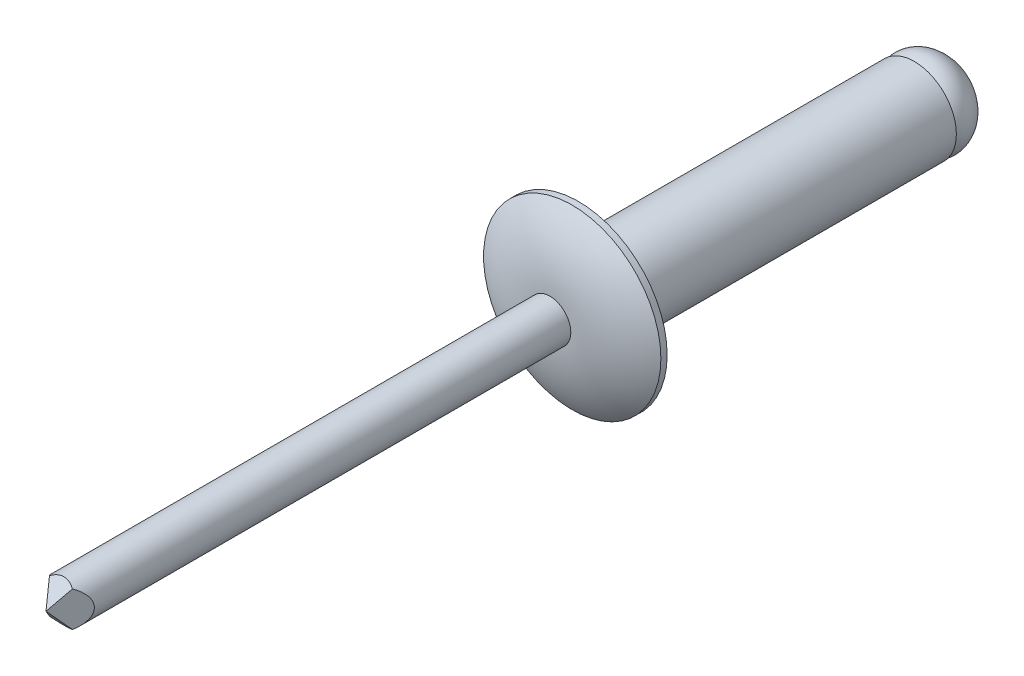
ISO-10303-21;
HEADER;
FILE_DESCRIPTION(('STEP AP214'),'2;1');
FILE_NAME('part.step','',(''),(''),'','','');
FILE_SCHEMA(('AUTOMOTIVE_DESIGN { 1 0 10303 214 1 1 1 1 }'));
ENDSEC;
DATA;
#1=APPLICATION_CONTEXT('core data for automotive mechanical design processes');
#2=APPLICATION_PROTOCOL_DEFINITION('international standard','automotive_design',2000,#1);
#3=PRODUCT_CONTEXT('',#1,'mechanical');
#4=PRODUCT('Part','Part','',(#3));
#5=PRODUCT_RELATED_PRODUCT_CATEGORY('part','',(#4));
#6=PRODUCT_DEFINITION_FORMATION('','',#4);
#7=PRODUCT_DEFINITION_CONTEXT('part definition',#1,'design');
#8=PRODUCT_DEFINITION('design','',#6,#7);
#9=PRODUCT_DEFINITION_SHAPE('','',#8);
#10=(LENGTH_UNIT() NAMED_UNIT(*) SI_UNIT(.MILLI.,.METRE.));
#11=(NAMED_UNIT(*) PLANE_ANGLE_UNIT() SI_UNIT($,.RADIAN.));
#12=(NAMED_UNIT(*) SI_UNIT($,.STERADIAN.) SOLID_ANGLE_UNIT());
#13=UNCERTAINTY_MEASURE_WITH_UNIT(LENGTH_MEASURE(1.E-05),#10,'distance_accuracy_value','');
#14=(GEOMETRIC_REPRESENTATION_CONTEXT(3) GLOBAL_UNCERTAINTY_ASSIGNED_CONTEXT((#13)) GLOBAL_UNIT_ASSIGNED_CONTEXT((#10,
#11,#12)) REPRESENTATION_CONTEXT('',''));
#15=CARTESIAN_POINT('',(0.,0.,0.));
#16=DIRECTION('',(0.,0.,1.));
#17=DIRECTION('',(1.,0.,0.));
#18=AXIS2_PLACEMENT_3D('',#15,#16,#17);
#19=CARTESIAN_POINT('',(0.,0.,-9.8298));
#20=DIRECTION('',(1.,0.,0.));
#21=DIRECTION('',(0.,-1.,0.));
#22=AXIS2_PLACEMENT_3D('',#19,#20,#21);
#23=ELLIPSE('',#22,1.190625,0.914400000000001);
#24=TRIMMED_CURVE('',#23,(PARAMETER_VALUE(1.5707963267949)),(PARAMETER_VALUE(4.71238898038469)),
.T.,.PARAMETER.);
#25=CARTESIAN_POINT('',(0.,0.,15.1003));
#26=DIRECTION('',(0.,0.,1.));
#27=AXIS1_PLACEMENT('',#25,#26);
#28=SURFACE_OF_REVOLUTION('',#24,#27);
#29=CARTESIAN_POINT('',(0.,0.,-9.525));
#30=DIRECTION('',(0.,0.,1.));
#31=DIRECTION('',(1.,0.,0.));
#32=AXIS2_PLACEMENT_3D('',#29,#30,#31);
#33=CIRCLE('',#32,1.12253201513364);
#34=CARTESIAN_POINT('',(1.12253201513364,0.,-9.525));
#35=VERTEX_POINT('',#34);
#36=EDGE_CURVE('E83',#35,#35,#33,.T.);
#37=ORIENTED_EDGE('',*,*,#36,.F.);
#38=EDGE_LOOP('',(#37));
#39=FACE_BOUND('',#38,.T.);
#40=CARTESIAN_POINT('',(0.,0.,-10.7442));
#41=VERTEX_POINT('',#40);
#42=VERTEX_LOOP('',#41);
#43=FACE_BOUND('',#42,.T.);
#44=ADVANCED_FACE('F34',(#39,#43),#28,.T.);
#45=CARTESIAN_POINT('',(0.,1.12253201513364,-9.525));
#46=DIRECTION('',(0.,0.,1.));
#47=DIRECTION('',(1.,0.,0.));
#48=AXIS2_PLACEMENT_3D('',#45,#46,#47);
#49=PLANE('',#48);
#50=CARTESIAN_POINT('',(0.,0.,-9.525));
#51=DIRECTION('',(0.,0.,1.));
#52=DIRECTION('',(1.,0.,0.));
#53=AXIS2_PLACEMENT_3D('',#50,#51,#52);
#54=CIRCLE('',#53,1.190625);
#55=CARTESIAN_POINT('',(1.190625,0.,-9.525));
#56=VERTEX_POINT('',#55);
#57=EDGE_CURVE('E87',#56,#56,#54,.T.);
#58=ORIENTED_EDGE('',*,*,#57,.F.);
#59=EDGE_LOOP('',(#58));
#60=FACE_BOUND('',#59,.T.);
#61=ORIENTED_EDGE('',*,*,#36,.T.);
#62=EDGE_LOOP('',(#61));
#63=FACE_BOUND('',#62,.T.);
#64=ADVANCED_FACE('F119',(#60,#63),#49,.F.);
#65=CARTESIAN_POINT('',(0.,0.,15.1003));
#66=DIRECTION('',(0.,0.,1.));
#67=DIRECTION('',(1.,0.,0.));
#68=AXIS2_PLACEMENT_3D('',#65,#66,#67);
#69=CYLINDRICAL_SURFACE('',#68,1.190625);
#70=CARTESIAN_POINT('',(0.,0.,0.));
#71=DIRECTION('',(0.,0.,1.));
#72=DIRECTION('',(1.,0.,0.));
#73=AXIS2_PLACEMENT_3D('',#70,#71,#72);
#74=CIRCLE('',#73,1.190625);
#75=CARTESIAN_POINT('',(1.190625,0.,0.));
#76=VERTEX_POINT('',#75);
#77=EDGE_CURVE('E92',#76,#76,#74,.T.);
#78=ORIENTED_EDGE('',*,*,#77,.F.);
#79=EDGE_LOOP('',(#78));
#80=FACE_BOUND('',#79,.T.);
#81=ORIENTED_EDGE('',*,*,#57,.T.);
#82=EDGE_LOOP('',(#81));
#83=FACE_BOUND('',#82,.T.);
#84=ADVANCED_FACE('F124',(#80,#83),#69,.T.);
#85=CARTESIAN_POINT('',(0.,1.190625,0.));
#86=DIRECTION('',(0.,0.,1.));
#87=DIRECTION('',(1.,0.,0.));
#88=AXIS2_PLACEMENT_3D('',#85,#86,#87);
#89=PLANE('',#88);
#90=CARTESIAN_POINT('',(0.,0.,0.));
#91=DIRECTION('',(0.,0.,1.));
#92=DIRECTION('',(1.,0.,0.));
#93=AXIS2_PLACEMENT_3D('',#90,#91,#92);
#94=CIRCLE('',#93,2.5146);
#95=CARTESIAN_POINT('',(2.5146,0.,0.));
#96=VERTEX_POINT('',#95);
#97=EDGE_CURVE('E95',#96,#96,#94,.T.);
#98=ORIENTED_EDGE('',*,*,#97,.F.);
#99=EDGE_LOOP('',(#98));
#100=FACE_BOUND('',#99,.T.);
#101=ORIENTED_EDGE('',*,*,#77,.T.);
#102=EDGE_LOOP('',(#101));
#103=FACE_BOUND('',#102,.T.);
#104=ADVANCED_FACE('F131',(#100,#103),#89,.F.);
#105=CARTESIAN_POINT('',(0.,0.,15.1003));
#106=DIRECTION('',(0.,0.,1.));
#107=DIRECTION('',(1.,0.,0.));
#108=AXIS2_PLACEMENT_3D('',#105,#106,#107);
#109=CYLINDRICAL_SURFACE('',#108,2.5146);
#110=CARTESIAN_POINT('',(0.,0.,0.177799999999999));
#111=DIRECTION('',(0.,0.,1.));
#112=DIRECTION('',(1.,0.,0.));
#113=AXIS2_PLACEMENT_3D('',#110,#111,#112);
#114=CIRCLE('',#113,2.5146);
#115=CARTESIAN_POINT('',(2.5146,0.,0.177799999999999));
#116=VERTEX_POINT('',#115);
#117=EDGE_CURVE('E98',#116,#116,#114,.T.);
#118=ORIENTED_EDGE('',*,*,#117,.F.);
#119=EDGE_LOOP('',(#118));
#120=FACE_BOUND('',#119,.T.);
#121=ORIENTED_EDGE('',*,*,#97,.T.);
#122=EDGE_LOOP('',(#121));
#123=FACE_BOUND('',#122,.T.);
#124=ADVANCED_FACE('F138',(#120,#123),#109,.T.);
#125=CARTESIAN_POINT('',(0.,0.,-2.40522323437499));
#126=DIRECTION('',(0.,0.,1.));
#127=DIRECTION('',(1.,0.,0.));
#128=AXIS2_PLACEMENT_3D('',#125,#126,#127);
#129=DEGENERATE_TOROIDAL_SURFACE('',#128,0.595312500000002,3.21802323437499,.T.);
#130=CARTESIAN_POINT('',(0.,0.,0.812800000000001));
#131=DIRECTION('',(0.,0.,1.));
#132=DIRECTION('',(1.,0.,0.));
#133=AXIS2_PLACEMENT_3D('',#130,#131,#132);
#134=CIRCLE('',#133,0.5953125);
#135=CARTESIAN_POINT('',(0.5953125,0.,0.812800000000001));
#136=VERTEX_POINT('',#135);
#137=EDGE_CURVE('E101',#136,#136,#134,.T.);
#138=ORIENTED_EDGE('',*,*,#137,.F.);
#139=EDGE_LOOP('',(#138));
#140=FACE_BOUND('',#139,.T.);
#141=ORIENTED_EDGE('',*,*,#117,.T.);
#142=EDGE_LOOP('',(#141));
#143=FACE_BOUND('',#142,.T.);
#144=ADVANCED_FACE('F142',(#140,#143),#129,.T.);
#145=CARTESIAN_POINT('',(0.,0.,15.1003));
#146=DIRECTION('',(0.,0.,1.));
#147=DIRECTION('',(1.,0.,0.));
#148=AXIS2_PLACEMENT_3D('',#145,#146,#147);
#149=CYLINDRICAL_SURFACE('',#148,0.595312499999999);
#150=CARTESIAN_POINT('',(0.,0.,15.1003));
#151=DIRECTION('',(-0.793353340291234,0.,-0.608761429008722));
#152=DIRECTION('',(-0.608761429008723,0.,0.793353340291234));
#153=AXIS2_PLACEMENT_3D('',#150,#151,#152);
#154=ELLIPSE('',#153,0.977907718249129,0.595312499999999);
#155=CARTESIAN_POINT('',(0.325200038106839,0.498640058430488,14.6764910590902));
#156=VERTEX_POINT('',#155);
#157=CARTESIAN_POINT('',(0.325200038106838,-0.498640058430487,14.6764910590902));
#158=VERTEX_POINT('',#157);
#159=EDGE_CURVE('E78',#156,#158,#154,.T.);
#160=ORIENTED_EDGE('',*,*,#159,.T.);
#161=CARTESIAN_POINT('',(0.,0.,15.1003));
#162=DIRECTION('',(0.,0.647617273393592,-0.761965791359592));
#163=DIRECTION('',(0.,0.761965791359592,0.647617273393593));
#164=AXIS2_PLACEMENT_3D('',#161,#162,#163);
#165=ELLIPSE('',#164,0.781285074409666,0.595312499999999);
#166=CARTESIAN_POINT('',(-0.325200038106838,-0.498640058430487,14.6764910590902));
#167=VERTEX_POINT('',#166);
#168=EDGE_CURVE('E103',#158,#167,#165,.T.);
#169=ORIENTED_EDGE('',*,*,#168,.T.);
#170=CARTESIAN_POINT('',(0.,0.,15.1003));
#171=DIRECTION('',(0.793353340291234,0.,-0.608761429008722));
#172=DIRECTION('',(0.608761429008722,0.,0.793353340291234));
#173=AXIS2_PLACEMENT_3D('',#170,#171,#172);
#174=ELLIPSE('',#173,0.97790771824913,0.595312499999999);
#175=CARTESIAN_POINT('',(-0.325200038106838,0.498640058430487,14.6764910590902));
#176=VERTEX_POINT('',#175);
#177=EDGE_CURVE('E71',#167,#176,#174,.T.);
#178=ORIENTED_EDGE('',*,*,#177,.T.);
#179=CARTESIAN_POINT('',(0.,0.,15.1003));
#180=DIRECTION('',(0.,-0.647617273393592,-0.761965791359592));
#181=DIRECTION('',(0.,-0.761965791359592,0.647617273393593));
#182=AXIS2_PLACEMENT_3D('',#179,#180,#181);
#183=ELLIPSE('',#182,0.781285074409666,0.595312499999999);
#184=EDGE_CURVE('E65',#176,#156,#183,.T.);
#185=ORIENTED_EDGE('',*,*,#184,.T.);
#186=EDGE_LOOP('',(#160,#169,#178,#185));
#187=FACE_BOUND('',#186,.T.);
#188=ORIENTED_EDGE('',*,*,#137,.T.);
#189=EDGE_LOOP('',(#188));
#190=FACE_BOUND('',#189,.T.);
#191=ADVANCED_FACE('F75',(#187,#190),#149,.T.);
#192=CARTESIAN_POINT('',(0.,-2.5146,15.1003));
#193=DIRECTION('',(0.793353340291234,0.,-0.608761429008722));
#194=DIRECTION('',(-0.608761429008722,0.,-0.793353340291234));
#195=AXIS2_PLACEMENT_3D('',#192,#193,#194);
#196=PLANE('',#195);
#197=ORIENTED_EDGE('',*,*,#177,.F.);
#198=DIRECTION('',(0.445015860775716,0.682357653189434,0.579955961079681));
#199=VECTOR('',#198,1.);
#200=CARTESIAN_POINT('',(-0.763583381661993,-1.17082785188173,14.1051787627382));
#201=LINE('',#200,#199);
#202=CARTESIAN_POINT('',(0.,0.,15.1003));
#203=VERTEX_POINT('',#202);
#204=EDGE_CURVE('E80',#167,#203,#201,.T.);
#205=ORIENTED_EDGE('',*,*,#204,.T.);
#206=DIRECTION('',(-0.445015860775716,0.682357653189434,-0.579955961079681));
#207=VECTOR('',#206,1.);
#208=CARTESIAN_POINT('',(0.763583381661993,-1.17082785188173,16.0954212372618));
#209=LINE('',#208,#207);
#210=EDGE_CURVE('E67',#203,#176,#209,.T.);
#211=ORIENTED_EDGE('',*,*,#210,.T.);
#212=EDGE_LOOP('',(#197,#205,#211));
#213=FACE_BOUND('',#212,.T.);
#214=ADVANCED_FACE('F109',(#213),#196,.F.);
#215=CARTESIAN_POINT('',(0.,-2.5146,15.1003));
#216=DIRECTION('',(-0.793353340291234,0.,-0.608761429008722));
#217=DIRECTION('',(-0.608761429008723,0.,0.793353340291234));
#218=AXIS2_PLACEMENT_3D('',#215,#216,#217);
#219=PLANE('',#218);
#220=DIRECTION('',(-0.445015860775717,-0.682357653189434,0.579955961079681));
#221=VECTOR('',#220,1.);
#222=CARTESIAN_POINT('',(-0.763583381661993,-1.17082785188173,16.0954212372618));
#223=LINE('',#222,#221);
#224=EDGE_CURVE('E42',#156,#203,#223,.T.);
#225=ORIENTED_EDGE('',*,*,#224,.T.);
#226=DIRECTION('',(0.445015860775717,-0.682357653189434,-0.579955961079681));
#227=VECTOR('',#226,1.);
#228=CARTESIAN_POINT('',(0.763583381661993,-1.17082785188173,14.1051787627382));
#229=LINE('',#228,#227);
#230=EDGE_CURVE('E11',#203,#158,#229,.T.);
#231=ORIENTED_EDGE('',*,*,#230,.T.);
#232=ORIENTED_EDGE('',*,*,#159,.F.);
#233=EDGE_LOOP('',(#225,#231,#232));
#234=FACE_BOUND('',#233,.T.);
#235=ADVANCED_FACE('F82',(#234),#219,.F.);
#236=CARTESIAN_POINT('',(-2.5146,0.,15.1003));
#237=DIRECTION('',(0.,-0.647617273393592,-0.761965791359592));
#238=DIRECTION('',(0.,0.761965791359592,-0.647617273393593));
#239=AXIS2_PLACEMENT_3D('',#236,#237,#238);
#240=PLANE('',#239);
#241=ORIENTED_EDGE('',*,*,#210,.F.);
#242=ORIENTED_EDGE('',*,*,#224,.F.);
#243=ORIENTED_EDGE('',*,*,#184,.F.);
#244=EDGE_LOOP('',(#241,#242,#243));
#245=FACE_BOUND('',#244,.T.);
#246=ADVANCED_FACE('F64',(#245),#240,.F.);
#247=CARTESIAN_POINT('',(-2.5146,-0.9128125,14.3244736452305));
#248=DIRECTION('',(0.,0.647617273393592,-0.761965791359592));
#249=DIRECTION('',(0.,0.761965791359592,0.647617273393593));
#250=AXIS2_PLACEMENT_3D('',#247,#248,#249);
#251=PLANE('',#250);
#252=ORIENTED_EDGE('',*,*,#230,.F.);
#253=ORIENTED_EDGE('',*,*,#204,.F.);
#254=ORIENTED_EDGE('',*,*,#168,.F.);
#255=EDGE_LOOP('',(#252,#253,#254));
#256=FACE_BOUND('',#255,.T.);
#257=ADVANCED_FACE('F110',(#256),#251,.F.);
#258=CLOSED_SHELL('',(#44,#64,#84,#104,#124,#144,#191,#214,#235,#246,#257));
#259=MANIFOLD_SOLID_BREP('B2',#258);
#260=ADVANCED_BREP_SHAPE_REPRESENTATION('',(#18,#259),#14);
#261=SHAPE_DEFINITION_REPRESENTATION(#9,#260);
ENDSEC;
END-ISO-10303-21;
